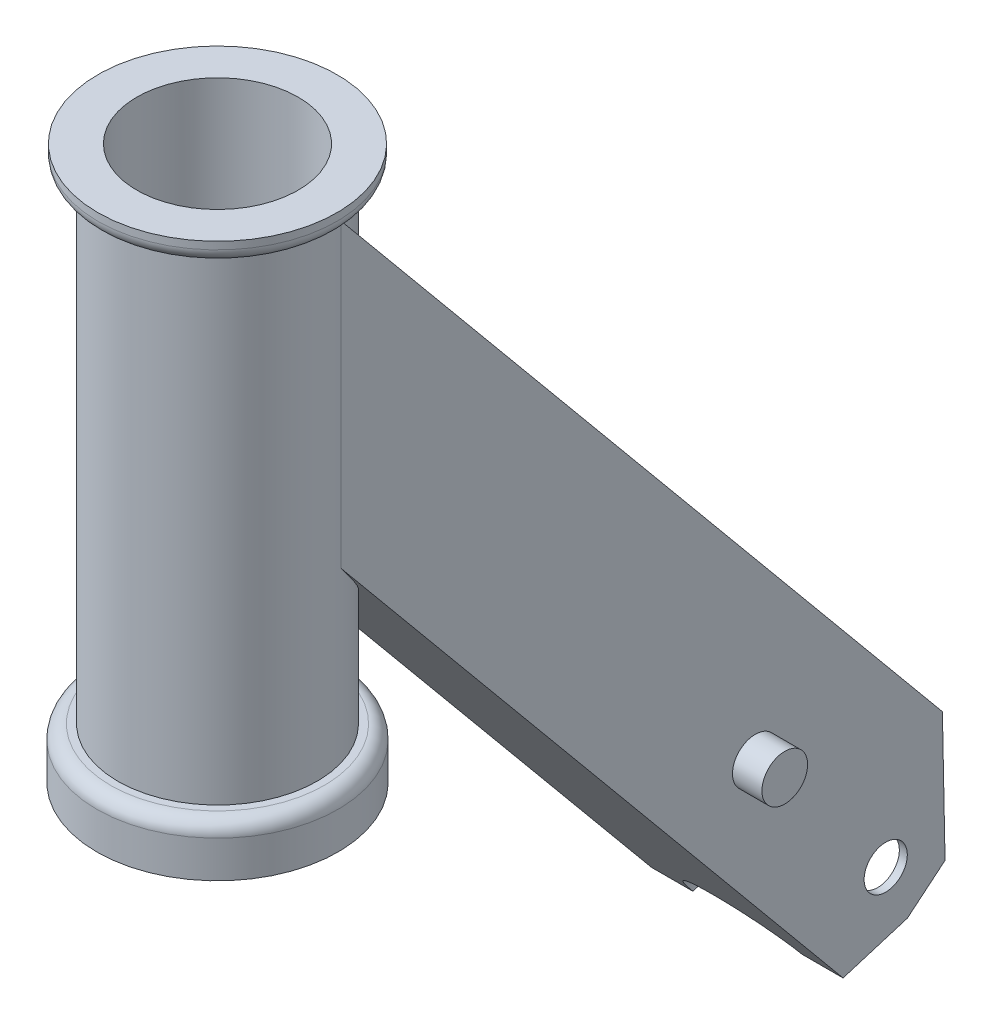
ISO-10303-21;
HEADER;
FILE_DESCRIPTION(('STEP AP214'),'2;1');
FILE_NAME('part.step','',(''),(''),'','','');
FILE_SCHEMA(('AUTOMOTIVE_DESIGN { 1 0 10303 214 1 1 1 1 }'));
ENDSEC;
DATA;
#1=APPLICATION_CONTEXT('core data for automotive mechanical design processes');
#2=APPLICATION_PROTOCOL_DEFINITION('international standard','automotive_design',2000,#1);
#3=PRODUCT_CONTEXT('',#1,'mechanical');
#4=PRODUCT('Part','Part','',(#3));
#5=PRODUCT_RELATED_PRODUCT_CATEGORY('part','',(#4));
#6=PRODUCT_DEFINITION_FORMATION('','',#4);
#7=PRODUCT_DEFINITION_CONTEXT('part definition',#1,'design');
#8=PRODUCT_DEFINITION('design','',#6,#7);
#9=PRODUCT_DEFINITION_SHAPE('','',#8);
#10=(LENGTH_UNIT() NAMED_UNIT(*) SI_UNIT(.MILLI.,.METRE.));
#11=(NAMED_UNIT(*) PLANE_ANGLE_UNIT() SI_UNIT($,.RADIAN.));
#12=(NAMED_UNIT(*) SI_UNIT($,.STERADIAN.) SOLID_ANGLE_UNIT());
#13=UNCERTAINTY_MEASURE_WITH_UNIT(LENGTH_MEASURE(1.E-05),#10,'distance_accuracy_value','');
#14=(GEOMETRIC_REPRESENTATION_CONTEXT(3) GLOBAL_UNCERTAINTY_ASSIGNED_CONTEXT((#13)) GLOBAL_UNIT_ASSIGNED_CONTEXT((#10,
#11,#12)) REPRESENTATION_CONTEXT('',''));
#15=CARTESIAN_POINT('',(0.,0.,0.));
#16=DIRECTION('',(0.,0.,1.));
#17=DIRECTION('',(1.,0.,0.));
#18=AXIS2_PLACEMENT_3D('',#15,#16,#17);
#19=CARTESIAN_POINT('',(17.5895,-103.728963419334,9.72419615617735));
#20=DIRECTION('',(-1.,0.,0.));
#21=DIRECTION('',(0.,0.,1.));
#22=AXIS2_PLACEMENT_3D('',#19,#20,#21);
#23=PLANE('',#22);
#24=DIRECTION('',(0.,0.769917595504677,0.63814331942934));
#25=VECTOR('',#24,1.);
#26=CARTESIAN_POINT('',(17.5895,97.6884,-3.31970481230389));
#27=LINE('',#26,#25);
#28=CARTESIAN_POINT('',(17.5895,-37.7445415549128,-115.572791881031));
#29=VERTEX_POINT('',#28);
#30=CARTESIAN_POINT('',(17.5895,95.5428335261872,-5.09804955939039));
#31=VERTEX_POINT('',#30);
#32=EDGE_CURVE('E232',#29,#31,#27,.T.);
#33=ORIENTED_EDGE('',*,*,#32,.T.);
#34=DIRECTION('',(0.,1.,0.));
#35=VECTOR('',#34,1.);
#36=CARTESIAN_POINT('',(17.5895,101.6,-5.09804955939038));
#37=LINE('',#36,#35);
#38=CARTESIAN_POINT('',(17.5895,40.2764083733887,-5.09804955939038));
#39=VERTEX_POINT('',#38);
#40=EDGE_CURVE('E293',#31,#39,#37,.F.);
#41=ORIENTED_EDGE('',*,*,#40,.T.);
#42=DIRECTION('',(0.,-0.769917595504677,-0.63814331942934));
#43=VECTOR('',#42,1.);
#44=CARTESIAN_POINT('',(17.5895,46.4271866374933,0.));
#45=LINE('',#44,#43);
#46=CARTESIAN_POINT('',(17.5895,-71.0023586589721,-97.3310394152556));
#47=VERTEX_POINT('',#46);
#48=EDGE_CURVE('E223',#39,#47,#45,.T.);
#49=ORIENTED_EDGE('',*,*,#48,.T.);
#50=DIRECTION('',(0.,0.292343394983634,-0.95631341066067));
#51=VECTOR('',#50,1.);
#52=CARTESIAN_POINT('',(17.5895,-67.3935548539361,-109.136154681815));
#53=LINE('',#52,#51);
#54=CARTESIAN_POINT('',(17.5895,-67.3935548539361,-109.136154681815));
#55=VERTEX_POINT('',#54);
#56=EDGE_CURVE('E225',#47,#55,#53,.T.);
#57=ORIENTED_EDGE('',*,*,#56,.T.);
#58=DIRECTION('',(0.,0.638143319429342,-0.769917595504675));
#59=VECTOR('',#58,1.);
#60=CARTESIAN_POINT('',(17.5895,-61.6556253829553,-116.058945733555));
#61=LINE('',#60,#59);
#62=CARTESIAN_POINT('',(17.5895,-61.6556253829553,-116.058945733555));
#63=VERTEX_POINT('',#62);
#64=EDGE_CURVE('E228',#55,#63,#61,.T.);
#65=ORIENTED_EDGE('',*,*,#64,.T.);
#66=DIRECTION('',(0.,0.999793374307165,0.0203275353029743));
#67=VECTOR('',#66,1.);
#68=CARTESIAN_POINT('',(17.5895,-37.7445415549128,-115.572791881031));
#69=LINE('',#68,#67);
#70=EDGE_CURVE('E230',#63,#29,#69,.T.);
#71=ORIENTED_EDGE('',*,*,#70,.T.);
#72=EDGE_LOOP('',(#33,#41,#49,#57,#65,#71));
#73=FACE_BOUND('',#72,.T.);
#74=CARTESIAN_POINT('',(17.5895,-57.2891396935477,-105.157137902319));
#75=DIRECTION('',(1.,0.,0.));
#76=DIRECTION('',(0.,0.,-1.));
#77=AXIS2_PLACEMENT_3D('',#74,#75,#76);
#78=CIRCLE('',#77,3.96875);
#79=CARTESIAN_POINT('',(17.5895,-57.2891396935477,-109.125887902319));
#80=VERTEX_POINT('',#79);
#81=EDGE_CURVE('E217',#80,#80,#78,.T.);
#82=ORIENTED_EDGE('',*,*,#81,.F.);
#83=EDGE_LOOP('',(#82));
#84=FACE_BOUND('',#83,.T.);
#85=CARTESIAN_POINT('',(17.5895,-28.3635746734894,-81.2070344289959));
#86=DIRECTION('',(-1.,0.,0.));
#87=DIRECTION('',(0.,0.,1.));
#88=AXIS2_PLACEMENT_3D('',#85,#86,#87);
#89=CIRCLE('',#88,4.19735);
#90=CARTESIAN_POINT('',(17.5895,-28.3635746734894,-77.0096844289959));
#91=VERTEX_POINT('',#90);
#92=EDGE_CURVE('E311',#91,#91,#89,.F.);
#93=ORIENTED_EDGE('',*,*,#92,.F.);
#94=EDGE_LOOP('',(#93));
#95=FACE_BOUND('',#94,.T.);
#96=ADVANCED_FACE('F35',(#73,#84,#95),#23,.F.);
#97=CARTESIAN_POINT('',(17.5895,-67.3935548539361,-109.136154681815));
#98=DIRECTION('',(0.,0.95631341066067,0.292343394983634));
#99=DIRECTION('',(0.,-0.292343394983634,0.95631341066067));
#100=AXIS2_PLACEMENT_3D('',#97,#98,#99);
#101=PLANE('',#100);
#102=DIRECTION('',(-1.,0.,0.));
#103=VECTOR('',#102,1.);
#104=CARTESIAN_POINT('',(17.5895,-71.0023586589721,-97.3310394152556));
#105=LINE('',#104,#103);
#106=CARTESIAN_POINT('',(10.0076,-71.0023586589721,-97.3310394152556));
#107=VERTEX_POINT('',#106);
#108=EDGE_CURVE('E261',#47,#107,#105,.T.);
#109=ORIENTED_EDGE('',*,*,#108,.T.);
#110=CARTESIAN_POINT('',(0.,-71.0023586589721,-97.3310394152557));
#111=DIRECTION('',(0.,0.95631341066067,0.292343394983634));
#112=DIRECTION('',(0.,-0.292343394983634,0.95631341066067));
#113=AXIS2_PLACEMENT_3D('',#110,#111,#112);
#114=ELLIPSE('',#113,25.9813025935332,10.0076);
#115=CARTESIAN_POINT('',(9.98901629563085,-70.5396915044803,-98.8445157314812));
#116=VERTEX_POINT('',#115);
#117=EDGE_CURVE('E400',#116,#107,#114,.F.);
#118=ORIENTED_EDGE('',*,*,#117,.F.);
#119=DIRECTION('',(1.,0.,0.));
#120=VECTOR('',#119,1.);
#121=CARTESIAN_POINT('',(17.5895,-70.5396915044803,-98.8445157314812));
#122=LINE('',#121,#120);
#123=CARTESIAN_POINT('',(16.129,-70.5396915044803,-98.8445157314812));
#124=VERTEX_POINT('',#123);
#125=EDGE_CURVE('E307',#116,#124,#122,.T.);
#126=ORIENTED_EDGE('',*,*,#125,.T.);
#127=DIRECTION('',(0.,0.292343394983634,-0.95631341066067));
#128=VECTOR('',#127,1.);
#129=CARTESIAN_POINT('',(16.129,-67.3935548539361,-109.136154681815));
#130=LINE('',#129,#128);
#131=CARTESIAN_POINT('',(16.129,-67.3935548539362,-109.136154681815));
#132=VERTEX_POINT('',#131);
#133=EDGE_CURVE('E206',#124,#132,#130,.T.);
#134=ORIENTED_EDGE('',*,*,#133,.T.);
#135=DIRECTION('',(-1.,0.,0.));
#136=VECTOR('',#135,1.);
#137=CARTESIAN_POINT('',(17.5895,-67.3935548539361,-109.136154681815));
#138=LINE('',#137,#136);
#139=EDGE_CURVE('E257',#55,#132,#138,.T.);
#140=ORIENTED_EDGE('',*,*,#139,.F.);
#141=ORIENTED_EDGE('',*,*,#56,.F.);
#142=EDGE_LOOP('',(#109,#118,#126,#134,#140,#141));
#143=FACE_BOUND('',#142,.T.);
#144=ADVANCED_FACE('F398',(#143),#101,.F.);
#145=CARTESIAN_POINT('',(17.5895,-37.7445415549128,-115.572791881031));
#146=DIRECTION('',(0.,-0.0203275353029743,0.999793374307165));
#147=DIRECTION('',(0.,-0.999793374307165,-0.0203275353029743));
#148=AXIS2_PLACEMENT_3D('',#145,#146,#147);
#149=PLANE('',#148);
#150=DIRECTION('',(-1.,0.,0.));
#151=VECTOR('',#150,1.);
#152=CARTESIAN_POINT('',(17.5895,-40.090765650667,-115.620494690793));
#153=LINE('',#152,#151);
#154=CARTESIAN_POINT('',(16.129,-40.090765650667,-115.620494690793));
#155=VERTEX_POINT('',#154);
#156=CARTESIAN_POINT('',(14.9225,-40.090765650667,-115.620494690793));
#157=VERTEX_POINT('',#156);
#158=EDGE_CURVE('E304',#155,#157,#153,.T.);
#159=ORIENTED_EDGE('',*,*,#158,.T.);
#160=DIRECTION('',(0.,-0.999793374307165,-0.0203275353029743));
#161=VECTOR('',#160,1.);
#162=CARTESIAN_POINT('',(14.9225,-124.841526703664,-117.343624821008));
#163=LINE('',#162,#161);
#164=CARTESIAN_POINT('',(14.9225,-37.7445415549128,-115.572791881031));
#165=VERTEX_POINT('',#164);
#166=EDGE_CURVE('E366',#165,#157,#163,.T.);
#167=ORIENTED_EDGE('',*,*,#166,.F.);
#168=DIRECTION('',(-1.,0.,0.));
#169=VECTOR('',#168,1.);
#170=CARTESIAN_POINT('',(17.5895,-37.7445415549128,-115.572791881031));
#171=LINE('',#170,#169);
#172=EDGE_CURVE('E249',#29,#165,#171,.T.);
#173=ORIENTED_EDGE('',*,*,#172,.F.);
#174=ORIENTED_EDGE('',*,*,#70,.F.);
#175=DIRECTION('',(-1.,0.,0.));
#176=VECTOR('',#175,1.);
#177=CARTESIAN_POINT('',(17.5895,-61.6556253829553,-116.058945733555));
#178=LINE('',#177,#176);
#179=CARTESIAN_POINT('',(16.129,-61.6556253829553,-116.058945733555));
#180=VERTEX_POINT('',#179);
#181=EDGE_CURVE('E253',#63,#180,#178,.T.);
#182=ORIENTED_EDGE('',*,*,#181,.T.);
#183=DIRECTION('',(0.,0.999793374307165,0.0203275353029743));
#184=VECTOR('',#183,1.);
#185=CARTESIAN_POINT('',(16.129,-37.7445415549128,-115.572791881031));
#186=LINE('',#185,#184);
#187=EDGE_CURVE('E203',#180,#155,#186,.T.);
#188=ORIENTED_EDGE('',*,*,#187,.T.);
#189=EDGE_LOOP('',(#159,#167,#173,#174,#182,#188));
#190=FACE_BOUND('',#189,.T.);
#191=ADVANCED_FACE('F365',(#190),#149,.F.);
#192=CARTESIAN_POINT('',(17.5895,-61.6556253829553,-116.058945733555));
#193=DIRECTION('',(0.,0.769917595504675,0.638143319429342));
#194=DIRECTION('',(0.,-0.638143319429342,0.769917595504675));
#195=AXIS2_PLACEMENT_3D('',#192,#193,#194);
#196=PLANE('',#195);
#197=CARTESIAN_POINT('',(-16.129,-61.6556253829553,-116.058945733555));
#198=VERTEX_POINT('',#197);
#199=CARTESIAN_POINT('',(-17.5895,-61.6556253829553,-116.058945733555));
#200=VERTEX_POINT('',#199);
#201=EDGE_CURVE('E252',#198,#200,#178,.T.);
#202=ORIENTED_EDGE('',*,*,#201,.F.);
#203=DIRECTION('',(0.,0.638143319429342,-0.769917595504675));
#204=VECTOR('',#203,1.);
#205=CARTESIAN_POINT('',(-16.129,-53.0892532772674,-126.394242543851));
#206=LINE('',#205,#204);
#207=CARTESIAN_POINT('',(-16.129,-67.3935548539362,-109.136154681815));
#208=VERTEX_POINT('',#207);
#209=EDGE_CURVE('E189',#208,#198,#206,.T.);
#210=ORIENTED_EDGE('',*,*,#209,.F.);
#211=CARTESIAN_POINT('',(-17.5895,-67.3935548539361,-109.136154681815));
#212=VERTEX_POINT('',#211);
#213=EDGE_CURVE('E256',#208,#212,#138,.T.);
#214=ORIENTED_EDGE('',*,*,#213,.T.);
#215=DIRECTION('',(0.,0.638143319429342,-0.769917595504675));
#216=VECTOR('',#215,1.);
#217=CARTESIAN_POINT('',(-17.5895,-61.6556253829553,-116.058945733555));
#218=LINE('',#217,#216);
#219=EDGE_CURVE('E241',#212,#200,#218,.T.);
#220=ORIENTED_EDGE('',*,*,#219,.T.);
#221=EDGE_LOOP('',(#202,#210,#214,#220));
#222=FACE_BOUND('',#221,.T.);
#223=ADVANCED_FACE('F346',(#222),#196,.F.);
#224=CARTESIAN_POINT('',(17.5895,-57.2891396935477,-105.157137902319));
#225=DIRECTION('',(-1.,0.,0.));
#226=DIRECTION('',(0.,0.,1.));
#227=AXIS2_PLACEMENT_3D('',#224,#225,#226);
#228=CYLINDRICAL_SURFACE('',#227,3.96875);
#229=CARTESIAN_POINT('',(-16.129,-57.2891396935477,-105.157137902319));
#230=DIRECTION('',(-1.,0.,0.));
#231=DIRECTION('',(0.,0.,1.));
#232=AXIS2_PLACEMENT_3D('',#229,#230,#231);
#233=CIRCLE('',#232,3.96875);
#234=CARTESIAN_POINT('',(-16.129,-57.2891396935477,-101.188387902319));
#235=VERTEX_POINT('',#234);
#236=EDGE_CURVE('E209',#235,#235,#233,.T.);
#237=ORIENTED_EDGE('',*,*,#236,.F.);
#238=EDGE_LOOP('',(#237));
#239=FACE_BOUND('',#238,.T.);
#240=CARTESIAN_POINT('',(-17.5895,-57.2891396935477,-105.157137902319));
#241=DIRECTION('',(1.,0.,0.));
#242=DIRECTION('',(0.,0.,-1.));
#243=AXIS2_PLACEMENT_3D('',#240,#241,#242);
#244=CIRCLE('',#243,3.96875);
#245=CARTESIAN_POINT('',(-17.5895,-57.2891396935477,-109.125887902319));
#246=VERTEX_POINT('',#245);
#247=EDGE_CURVE('E216',#246,#246,#244,.T.);
#248=ORIENTED_EDGE('',*,*,#247,.F.);
#249=EDGE_LOOP('',(#248));
#250=FACE_BOUND('',#249,.T.);
#251=ADVANCED_FACE('F470',(#239,#250),#228,.F.);
#252=CARTESIAN_POINT('',(0.,101.6,0.));
#253=DIRECTION('',(0.,1.,0.));
#254=DIRECTION('',(0.,0.,1.));
#255=AXIS2_PLACEMENT_3D('',#252,#253,#254);
#256=CYLINDRICAL_SURFACE('',#255,18.3134);
#257=CARTESIAN_POINT('',(0.,9.3218,0.));
#258=DIRECTION('',(0.,1.,0.));
#259=DIRECTION('',(0.,0.,1.));
#260=AXIS2_PLACEMENT_3D('',#257,#258,#259);
#261=CIRCLE('',#260,18.3134);
#262=CARTESIAN_POINT('',(0.,9.3218,18.3134));
#263=VERTEX_POINT('',#262);
#264=EDGE_CURVE('E276',#263,#263,#261,.T.);
#265=ORIENTED_EDGE('',*,*,#264,.T.);
#266=EDGE_LOOP('',(#265));
#267=FACE_BOUND('',#266,.T.);
#268=CARTESIAN_POINT('',(0.,97.6884,0.));
#269=DIRECTION('',(0.,1.,0.));
#270=DIRECTION('',(0.,0.,1.));
#271=AXIS2_PLACEMENT_3D('',#268,#269,#270);
#272=CIRCLE('',#271,18.3134);
#273=CARTESIAN_POINT('',(0.,97.6884,18.3134));
#274=VERTEX_POINT('',#273);
#275=EDGE_CURVE('E273',#274,#274,#272,.T.);
#276=ORIENTED_EDGE('',*,*,#275,.F.);
#277=EDGE_LOOP('',(#276));
#278=FACE_BOUND('',#277,.T.);
#279=CARTESIAN_POINT('',(0.,46.4271866374933,0.));
#280=DIRECTION('',(0.,0.63814331942934,-0.769917595504677));
#281=DIRECTION('',(0.,0.769917595504677,0.63814331942934));
#282=AXIS2_PLACEMENT_3D('',#279,#280,#281);
#283=ELLIPSE('',#282,28.6979420490945,18.3134);
#284=CARTESIAN_POINT('',(-17.5895,40.2764083733887,-5.09804955939038));
#285=VERTEX_POINT('',#284);
#286=EDGE_CURVE('E296',#39,#285,#283,.T.);
#287=ORIENTED_EDGE('',*,*,#286,.F.);
#288=ORIENTED_EDGE('',*,*,#40,.F.);
#289=CARTESIAN_POINT('',(0.,101.693611790292,0.));
#290=DIRECTION('',(0.,-0.63814331942934,0.769917595504677));
#291=DIRECTION('',(0.,0.769917595504677,0.63814331942934));
#292=AXIS2_PLACEMENT_3D('',#289,#290,#291);
#293=ELLIPSE('',#292,28.6979420490945,18.3134);
#294=CARTESIAN_POINT('',(-17.5895,95.5428335261872,-5.09804955939039));
#295=VERTEX_POINT('',#294);
#296=EDGE_CURVE('E288',#295,#31,#293,.T.);
#297=ORIENTED_EDGE('',*,*,#296,.F.);
#298=DIRECTION('',(0.,1.,0.));
#299=VECTOR('',#298,1.);
#300=CARTESIAN_POINT('',(-17.5895,101.6,-5.09804955939038));
#301=LINE('',#300,#299);
#302=EDGE_CURVE('E291',#295,#285,#301,.F.);
#303=ORIENTED_EDGE('',*,*,#302,.T.);
#304=EDGE_LOOP('',(#287,#288,#297,#303));
#305=FACE_BOUND('',#304,.T.);
#306=ADVANCED_FACE('F356',(#267,#278,#305),#256,.T.);
#307=CARTESIAN_POINT('',(0.,0.,0.));
#308=DIRECTION('',(0.,1.,0.));
#309=DIRECTION('',(0.,0.,1.));
#310=AXIS2_PLACEMENT_3D('',#307,#308,#309);
#311=PLANE('',#310);
#312=CARTESIAN_POINT('',(0.,0.,0.));
#313=DIRECTION('',(0.,-1.,0.));
#314=DIRECTION('',(0.,0.,-1.));
#315=AXIS2_PLACEMENT_3D('',#312,#313,#314);
#316=CIRCLE('',#315,14.8209);
#317=CARTESIAN_POINT('',(0.,0.,-14.8209));
#318=VERTEX_POINT('',#317);
#319=EDGE_CURVE('E494',#318,#318,#316,.T.);
#320=ORIENTED_EDGE('',*,*,#319,.F.);
#321=EDGE_LOOP('',(#320));
#322=FACE_BOUND('',#321,.T.);
#323=CARTESIAN_POINT('',(0.,0.,0.));
#324=DIRECTION('',(0.,1.,0.));
#325=DIRECTION('',(0.,0.,1.));
#326=AXIS2_PLACEMENT_3D('',#323,#324,#325);
#327=CIRCLE('',#326,22.1742);
#328=CARTESIAN_POINT('',(0.,0.,22.1742));
#329=VERTEX_POINT('',#328);
#330=EDGE_CURVE('E285',#329,#329,#327,.T.);
#331=ORIENTED_EDGE('',*,*,#330,.F.);
#332=EDGE_LOOP('',(#331));
#333=FACE_BOUND('',#332,.T.);
#334=ADVANCED_FACE('F37',(#322,#333),#311,.F.);
#335=CARTESIAN_POINT('',(0.,101.6,0.));
#336=DIRECTION('',(0.,1.,0.));
#337=DIRECTION('',(0.,0.,1.));
#338=AXIS2_PLACEMENT_3D('',#335,#336,#337);
#339=CYLINDRICAL_SURFACE('',#338,22.1742);
#340=CARTESIAN_POINT('',(0.,6.7818,0.));
#341=DIRECTION('',(0.,1.,0.));
#342=DIRECTION('',(0.,0.,1.));
#343=AXIS2_PLACEMENT_3D('',#340,#341,#342);
#344=CIRCLE('',#343,22.1742);
#345=CARTESIAN_POINT('',(0.,6.7818,22.1742));
#346=VERTEX_POINT('',#345);
#347=EDGE_CURVE('E282',#346,#346,#344,.T.);
#348=ORIENTED_EDGE('',*,*,#347,.F.);
#349=EDGE_LOOP('',(#348));
#350=FACE_BOUND('',#349,.T.);
#351=ORIENTED_EDGE('',*,*,#330,.T.);
#352=EDGE_LOOP('',(#351));
#353=FACE_BOUND('',#352,.T.);
#354=ADVANCED_FACE('F477',(#350,#353),#339,.T.);
#355=CARTESIAN_POINT('',(0.,6.7818,0.));
#356=DIRECTION('',(0.,1.,0.));
#357=DIRECTION('',(0.,0.,1.));
#358=AXIS2_PLACEMENT_3D('',#355,#356,#357);
#359=TOROIDAL_SURFACE('',#358,19.6342,2.54);
#360=CARTESIAN_POINT('',(0.,9.3218,0.));
#361=DIRECTION('',(0.,1.,0.));
#362=DIRECTION('',(0.,0.,1.));
#363=AXIS2_PLACEMENT_3D('',#360,#361,#362);
#364=CIRCLE('',#363,19.6342);
#365=CARTESIAN_POINT('',(0.,9.3218,19.6342));
#366=VERTEX_POINT('',#365);
#367=EDGE_CURVE('E279',#366,#366,#364,.T.);
#368=ORIENTED_EDGE('',*,*,#367,.F.);
#369=EDGE_LOOP('',(#368));
#370=FACE_BOUND('',#369,.T.);
#371=ORIENTED_EDGE('',*,*,#347,.T.);
#372=EDGE_LOOP('',(#371));
#373=FACE_BOUND('',#372,.T.);
#374=ADVANCED_FACE('F474',(#370,#373),#359,.T.);
#375=CARTESIAN_POINT('',(19.6342,9.3218,0.));
#376=DIRECTION('',(0.,-1.,0.));
#377=DIRECTION('',(0.,0.,-1.));
#378=AXIS2_PLACEMENT_3D('',#375,#376,#377);
#379=PLANE('',#378);
#380=ORIENTED_EDGE('',*,*,#264,.F.);
#381=EDGE_LOOP('',(#380));
#382=FACE_BOUND('',#381,.T.);
#383=ORIENTED_EDGE('',*,*,#367,.T.);
#384=EDGE_LOOP('',(#383));
#385=FACE_BOUND('',#384,.T.);
#386=ADVANCED_FACE('F466',(#382,#385),#379,.F.);
#387=CARTESIAN_POINT('',(18.3134,97.6884,0.));
#388=DIRECTION('',(0.,1.,0.));
#389=DIRECTION('',(0.,0.,1.));
#390=AXIS2_PLACEMENT_3D('',#387,#388,#389);
#391=PLANE('',#390);
#392=CARTESIAN_POINT('',(0.,97.6884,0.));
#393=DIRECTION('',(0.,1.,0.));
#394=DIRECTION('',(0.,0.,1.));
#395=AXIS2_PLACEMENT_3D('',#392,#393,#394);
#396=CIRCLE('',#395,19.431);
#397=CARTESIAN_POINT('',(0.,97.6884,19.431));
#398=VERTEX_POINT('',#397);
#399=EDGE_CURVE('E270',#398,#398,#396,.T.);
#400=ORIENTED_EDGE('',*,*,#399,.F.);
#401=EDGE_LOOP('',(#400));
#402=FACE_BOUND('',#401,.T.);
#403=ORIENTED_EDGE('',*,*,#275,.T.);
#404=EDGE_LOOP('',(#403));
#405=FACE_BOUND('',#404,.T.);
#406=ADVANCED_FACE('F462',(#402,#405),#391,.F.);
#407=CARTESIAN_POINT('',(0.,100.2284,0.));
#408=DIRECTION('',(0.,1.,0.));
#409=DIRECTION('',(0.,0.,1.));
#410=AXIS2_PLACEMENT_3D('',#407,#408,#409);
#411=TOROIDAL_SURFACE('',#410,19.431,2.54);
#412=CARTESIAN_POINT('',(0.,100.2284,0.));
#413=DIRECTION('',(0.,1.,0.));
#414=DIRECTION('',(0.,0.,1.));
#415=AXIS2_PLACEMENT_3D('',#412,#413,#414);
#416=CIRCLE('',#415,21.971);
#417=CARTESIAN_POINT('',(0.,100.2284,21.971));
#418=VERTEX_POINT('',#417);
#419=EDGE_CURVE('E267',#418,#418,#416,.T.);
#420=ORIENTED_EDGE('',*,*,#419,.F.);
#421=EDGE_LOOP('',(#420));
#422=FACE_BOUND('',#421,.T.);
#423=ORIENTED_EDGE('',*,*,#399,.T.);
#424=EDGE_LOOP('',(#423));
#425=FACE_BOUND('',#424,.T.);
#426=ADVANCED_FACE('F458',(#422,#425),#411,.T.);
#427=CARTESIAN_POINT('',(0.,101.6,0.));
#428=DIRECTION('',(0.,1.,0.));
#429=DIRECTION('',(0.,0.,1.));
#430=AXIS2_PLACEMENT_3D('',#427,#428,#429);
#431=CYLINDRICAL_SURFACE('',#430,21.971);
#432=CARTESIAN_POINT('',(0.,101.6,0.));
#433=DIRECTION('',(0.,1.,0.));
#434=DIRECTION('',(0.,0.,1.));
#435=AXIS2_PLACEMENT_3D('',#432,#433,#434);
#436=CIRCLE('',#435,21.971);
#437=CARTESIAN_POINT('',(0.,101.6,21.971));
#438=VERTEX_POINT('',#437);
#439=EDGE_CURVE('E264',#438,#438,#436,.T.);
#440=ORIENTED_EDGE('',*,*,#439,.F.);
#441=EDGE_LOOP('',(#440));
#442=FACE_BOUND('',#441,.T.);
#443=ORIENTED_EDGE('',*,*,#419,.T.);
#444=EDGE_LOOP('',(#443));
#445=FACE_BOUND('',#444,.T.);
#446=ADVANCED_FACE('F454',(#442,#445),#431,.T.);
#447=CARTESIAN_POINT('',(21.971,101.6,0.));
#448=DIRECTION('',(0.,-1.,0.));
#449=DIRECTION('',(0.,0.,-1.));
#450=AXIS2_PLACEMENT_3D('',#447,#448,#449);
#451=PLANE('',#450);
#452=CARTESIAN_POINT('',(0.,101.6,0.));
#453=DIRECTION('',(0.,-1.,0.));
#454=DIRECTION('',(0.,0.,-1.));
#455=AXIS2_PLACEMENT_3D('',#452,#453,#454);
#456=CIRCLE('',#455,14.8209);
#457=CARTESIAN_POINT('',(0.,101.6,-14.8209));
#458=VERTEX_POINT('',#457);
#459=EDGE_CURVE('E174',#458,#458,#456,.T.);
#460=ORIENTED_EDGE('',*,*,#459,.T.);
#461=EDGE_LOOP('',(#460));
#462=FACE_BOUND('',#461,.T.);
#463=ORIENTED_EDGE('',*,*,#439,.T.);
#464=EDGE_LOOP('',(#463));
#465=FACE_BOUND('',#464,.T.);
#466=ADVANCED_FACE('F322',(#462,#465),#451,.F.);
#467=CARTESIAN_POINT('',(-17.5895,-103.728963419334,9.72419615617735));
#468=DIRECTION('',(-1.,0.,0.));
#469=DIRECTION('',(0.,0.,1.));
#470=AXIS2_PLACEMENT_3D('',#467,#468,#469);
#471=PLANE('',#470);
#472=CARTESIAN_POINT('',(-17.5895,-28.3635746734894,-81.2070344289959));
#473=DIRECTION('',(-1.,0.,0.));
#474=DIRECTION('',(0.,0.,1.));
#475=AXIS2_PLACEMENT_3D('',#472,#473,#474);
#476=CIRCLE('',#475,4.19735);
#477=CARTESIAN_POINT('',(-17.5895,-28.3635746734894,-77.0096844289959));
#478=VERTEX_POINT('',#477);
#479=EDGE_CURVE('E43',#478,#478,#476,.T.);
#480=ORIENTED_EDGE('',*,*,#479,.F.);
#481=EDGE_LOOP('',(#480));
#482=FACE_BOUND('',#481,.T.);
#483=ORIENTED_EDGE('',*,*,#247,.T.);
#484=EDGE_LOOP('',(#483));
#485=FACE_BOUND('',#484,.T.);
#486=ORIENTED_EDGE('',*,*,#302,.F.);
#487=DIRECTION('',(0.,0.769917595504677,0.63814331942934));
#488=VECTOR('',#487,1.);
#489=CARTESIAN_POINT('',(-17.5895,97.6884,-3.31970481230389));
#490=LINE('',#489,#488);
#491=CARTESIAN_POINT('',(-17.5895,-37.7445415549128,-115.572791881031));
#492=VERTEX_POINT('',#491);
#493=EDGE_CURVE('E226',#492,#295,#490,.T.);
#494=ORIENTED_EDGE('',*,*,#493,.F.);
#495=DIRECTION('',(0.,0.999793374307165,0.0203275353029743));
#496=VECTOR('',#495,1.);
#497=CARTESIAN_POINT('',(-17.5895,-37.7445415549128,-115.572791881031));
#498=LINE('',#497,#496);
#499=EDGE_CURVE('E244',#200,#492,#498,.T.);
#500=ORIENTED_EDGE('',*,*,#499,.F.);
#501=ORIENTED_EDGE('',*,*,#219,.F.);
#502=DIRECTION('',(0.,0.292343394983634,-0.95631341066067));
#503=VECTOR('',#502,1.);
#504=CARTESIAN_POINT('',(-17.5895,-67.3935548539361,-109.136154681815));
#505=LINE('',#504,#503);
#506=CARTESIAN_POINT('',(-17.5895,-71.0023586589721,-97.3310394152556));
#507=VERTEX_POINT('',#506);
#508=EDGE_CURVE('E238',#507,#212,#505,.T.);
#509=ORIENTED_EDGE('',*,*,#508,.F.);
#510=DIRECTION('',(0.,-0.769917595504677,-0.63814331942934));
#511=VECTOR('',#510,1.);
#512=CARTESIAN_POINT('',(-17.5895,46.4271866374933,0.));
#513=LINE('',#512,#511);
#514=EDGE_CURVE('E220',#285,#507,#513,.T.);
#515=ORIENTED_EDGE('',*,*,#514,.F.);
#516=EDGE_LOOP('',(#486,#494,#500,#501,#509,#515));
#517=FACE_BOUND('',#516,.T.);
#518=ADVANCED_FACE('F318',(#482,#485,#517),#471,.T.);
#519=CARTESIAN_POINT('',(17.5895,46.4271866374933,0.));
#520=DIRECTION('',(0.,0.63814331942934,-0.769917595504677));
#521=DIRECTION('',(0.,0.769917595504677,0.63814331942934));
#522=AXIS2_PLACEMENT_3D('',#519,#520,#521);
#523=PLANE('',#522);
#524=CARTESIAN_POINT('',(-10.0076,-71.0023586589721,-97.3310394152556));
#525=VERTEX_POINT('',#524);
#526=EDGE_CURVE('E260',#525,#507,#105,.T.);
#527=ORIENTED_EDGE('',*,*,#526,.F.);
#528=CARTESIAN_POINT('',(0.,-71.0023586589721,-97.3310394152556));
#529=DIRECTION('',(0.,-0.63814331942934,0.769917595504677));
#530=DIRECTION('',(0.,0.769917595504677,0.63814331942934));
#531=AXIS2_PLACEMENT_3D('',#528,#529,#530);
#532=CIRCLE('',#531,10.0076);
#533=EDGE_CURVE('E409',#107,#525,#532,.T.);
#534=ORIENTED_EDGE('',*,*,#533,.F.);
#535=ORIENTED_EDGE('',*,*,#108,.F.);
#536=ORIENTED_EDGE('',*,*,#48,.F.);
#537=ORIENTED_EDGE('',*,*,#286,.T.);
#538=ORIENTED_EDGE('',*,*,#514,.T.);
#539=EDGE_LOOP('',(#527,#534,#535,#536,#537,#538));
#540=FACE_BOUND('',#539,.T.);
#541=ADVANCED_FACE('F321',(#540),#523,.F.);
#542=CARTESIAN_POINT('',(17.5895,97.6884,-3.31970481230389));
#543=DIRECTION('',(0.,-0.63814331942934,0.769917595504677));
#544=DIRECTION('',(0.,-0.769917595504677,-0.63814331942934));
#545=AXIS2_PLACEMENT_3D('',#542,#543,#544);
#546=PLANE('',#545);
#547=ORIENTED_EDGE('',*,*,#172,.T.);
#548=DIRECTION('',(0.,-0.769917595504676,-0.638143319429341));
#549=VECTOR('',#548,1.);
#550=CARTESIAN_POINT('',(14.9225,-45.5170161209302,-122.01497835488));
#551=LINE('',#550,#549);
#552=CARTESIAN_POINT('',(14.9225,-33.8431381232119,-112.339128238487));
#553=VERTEX_POINT('',#552);
#554=EDGE_CURVE('E362',#553,#165,#551,.T.);
#555=ORIENTED_EDGE('',*,*,#554,.F.);
#556=CARTESIAN_POINT('',(0.,-33.8431381232119,-112.339128238487));
#557=DIRECTION('',(0.,0.63814331942934,-0.769917595504677));
#558=DIRECTION('',(0.,-0.769917595504677,-0.63814331942934));
#559=AXIS2_PLACEMENT_3D('',#556,#557,#558);
#560=CIRCLE('',#559,14.9225);
#561=CARTESIAN_POINT('',(-14.9225,-33.8431381232119,-112.339128238487));
#562=VERTEX_POINT('',#561);
#563=EDGE_CURVE('E380',#562,#553,#560,.T.);
#564=ORIENTED_EDGE('',*,*,#563,.F.);
#565=DIRECTION('',(0.,0.769917595504676,0.638143319429341));
#566=VECTOR('',#565,1.);
#567=CARTESIAN_POINT('',(-14.9225,-33.8431381232119,-112.339128238487));
#568=LINE('',#567,#566);
#569=CARTESIAN_POINT('',(-14.9225,-37.7445415549128,-115.572791881031));
#570=VERTEX_POINT('',#569);
#571=EDGE_CURVE('E339',#570,#562,#568,.T.);
#572=ORIENTED_EDGE('',*,*,#571,.F.);
#573=EDGE_CURVE('E235',#570,#492,#171,.T.);
#574=ORIENTED_EDGE('',*,*,#573,.T.);
#575=ORIENTED_EDGE('',*,*,#493,.T.);
#576=ORIENTED_EDGE('',*,*,#296,.T.);
#577=ORIENTED_EDGE('',*,*,#32,.F.);
#578=EDGE_LOOP('',(#547,#555,#564,#572,#574,#575,#576,#577));
#579=FACE_BOUND('',#578,.T.);
#580=ADVANCED_FACE('F333',(#579),#546,.F.);
#581=CARTESIAN_POINT('',(-16.129,-70.5396915044803,-98.8445157314812));
#582=VERTEX_POINT('',#581);
#583=CARTESIAN_POINT('',(-9.98901629563086,-70.5396915044803,-98.8445157314812));
#584=VERTEX_POINT('',#583);
#585=EDGE_CURVE('E308',#582,#584,#122,.T.);
#586=ORIENTED_EDGE('',*,*,#585,.T.);
#587=EDGE_CURVE('E56',#525,#584,#114,.F.);
#588=ORIENTED_EDGE('',*,*,#587,.F.);
#589=ORIENTED_EDGE('',*,*,#526,.T.);
#590=ORIENTED_EDGE('',*,*,#508,.T.);
#591=ORIENTED_EDGE('',*,*,#213,.F.);
#592=DIRECTION('',(0.,-0.292343394983634,0.95631341066067));
#593=VECTOR('',#592,1.);
#594=CARTESIAN_POINT('',(-16.129,-67.3935548539361,-109.136154681815));
#595=LINE('',#594,#593);
#596=EDGE_CURVE('E213',#208,#582,#595,.T.);
#597=ORIENTED_EDGE('',*,*,#596,.T.);
#598=EDGE_LOOP('',(#586,#588,#589,#590,#591,#597));
#599=FACE_BOUND('',#598,.T.);
#600=ADVANCED_FACE('F350',(#599),#101,.F.);
#601=ORIENTED_EDGE('',*,*,#139,.T.);
#602=DIRECTION('',(0.,-0.638143319429342,0.769917595504675));
#603=VECTOR('',#602,1.);
#604=CARTESIAN_POINT('',(16.129,-53.0892532772674,-126.394242543851));
#605=LINE('',#604,#603);
#606=EDGE_CURVE('E191',#180,#132,#605,.T.);
#607=ORIENTED_EDGE('',*,*,#606,.F.);
#608=ORIENTED_EDGE('',*,*,#181,.F.);
#609=ORIENTED_EDGE('',*,*,#64,.F.);
#610=EDGE_LOOP('',(#601,#607,#608,#609));
#611=FACE_BOUND('',#610,.T.);
#612=ADVANCED_FACE('F445',(#611),#196,.F.);
#613=ORIENTED_EDGE('',*,*,#573,.F.);
#614=DIRECTION('',(0.,0.999793374307165,0.0203275353029743));
#615=VECTOR('',#614,1.);
#616=CARTESIAN_POINT('',(-14.9225,-112.97582690939,-117.10237454104));
#617=LINE('',#616,#615);
#618=CARTESIAN_POINT('',(-14.9225,-40.090765650667,-115.620494690793));
#619=VERTEX_POINT('',#618);
#620=EDGE_CURVE('E371',#619,#570,#617,.T.);
#621=ORIENTED_EDGE('',*,*,#620,.F.);
#622=CARTESIAN_POINT('',(-16.129,-40.090765650667,-115.620494690793));
#623=VERTEX_POINT('',#622);
#624=EDGE_CURVE('E299',#619,#623,#153,.T.);
#625=ORIENTED_EDGE('',*,*,#624,.T.);
#626=DIRECTION('',(0.,-0.999793374307165,-0.0203275353029743));
#627=VECTOR('',#626,1.);
#628=CARTESIAN_POINT('',(-16.129,-37.7445415549128,-115.572791881031));
#629=LINE('',#628,#627);
#630=EDGE_CURVE('E210',#623,#198,#629,.T.);
#631=ORIENTED_EDGE('',*,*,#630,.T.);
#632=ORIENTED_EDGE('',*,*,#201,.T.);
#633=ORIENTED_EDGE('',*,*,#499,.T.);
#634=EDGE_LOOP('',(#613,#621,#625,#631,#632,#633));
#635=FACE_BOUND('',#634,.T.);
#636=ADVANCED_FACE('F342',(#635),#149,.F.);
#637=CARTESIAN_POINT('',(16.129,-57.2891396935477,-105.157137902319));
#638=DIRECTION('',(1.,0.,0.));
#639=DIRECTION('',(0.,0.,-1.));
#640=AXIS2_PLACEMENT_3D('',#637,#638,#639);
#641=CIRCLE('',#640,3.96875);
#642=CARTESIAN_POINT('',(16.129,-57.2891396935477,-109.125887902319));
#643=VERTEX_POINT('',#642);
#644=EDGE_CURVE('E198',#643,#643,#641,.T.);
#645=ORIENTED_EDGE('',*,*,#644,.F.);
#646=EDGE_LOOP('',(#645));
#647=FACE_BOUND('',#646,.T.);
#648=ORIENTED_EDGE('',*,*,#81,.T.);
#649=EDGE_LOOP('',(#648));
#650=FACE_BOUND('',#649,.T.);
#651=ADVANCED_FACE('F439',(#647,#650),#228,.F.);
#652=CARTESIAN_POINT('',(-16.129,41.3553008419265,-6.10076982884153));
#653=DIRECTION('',(0.,-0.638143319429342,0.769917595504675));
#654=DIRECTION('',(0.,-0.769917595504675,-0.638143319429342));
#655=AXIS2_PLACEMENT_3D('',#652,#653,#654);
#656=PLANE('',#655);
#657=DIRECTION('',(-1.,0.,0.));
#658=VECTOR('',#657,1.);
#659=CARTESIAN_POINT('',(-16.129,41.3553008419265,-6.10076982884153));
#660=LINE('',#659,#658);
#661=CARTESIAN_POINT('',(-13.5070235176184,41.3553008419265,-6.10076982884153));
#662=VERTEX_POINT('',#661);
#663=CARTESIAN_POINT('',(-16.129,41.3553008419265,-6.10076982884153));
#664=VERTEX_POINT('',#663);
#665=EDGE_CURVE('E172',#662,#664,#660,.T.);
#666=ORIENTED_EDGE('',*,*,#665,.F.);
#667=CARTESIAN_POINT('',(0.,48.7158574666507,0.));
#668=DIRECTION('',(0.,-0.638143319429342,0.769917595504675));
#669=DIRECTION('',(0.,-0.769917595504675,-0.638143319429342));
#670=AXIS2_PLACEMENT_3D('',#667,#668,#669);
#671=ELLIPSE('',#670,23.2250335445861,14.8209);
#672=CARTESIAN_POINT('',(13.5070235176184,41.3553008419265,-6.10076982884153));
#673=VERTEX_POINT('',#672);
#674=EDGE_CURVE('E49',#662,#673,#671,.T.);
#675=ORIENTED_EDGE('',*,*,#674,.T.);
#676=CARTESIAN_POINT('',(16.129,41.3553008419265,-6.10076982884153));
#677=VERTEX_POINT('',#676);
#678=EDGE_CURVE('E170',#677,#673,#660,.T.);
#679=ORIENTED_EDGE('',*,*,#678,.F.);
#680=DIRECTION('',(0.,-0.769917595504675,-0.638143319429342));
#681=VECTOR('',#680,1.);
#682=CARTESIAN_POINT('',(16.129,41.3553008419265,-6.10076982884153));
#683=LINE('',#682,#681);
#684=EDGE_CURVE('E199',#677,#124,#683,.T.);
#685=ORIENTED_EDGE('',*,*,#684,.T.);
#686=ORIENTED_EDGE('',*,*,#125,.F.);
#687=CARTESIAN_POINT('',(0.,-70.0703503409456,-98.4555040634902));
#688=DIRECTION('',(0.,-0.638143319429342,0.769917595504675));
#689=DIRECTION('',(0.,-0.769917595504675,-0.638143319429342));
#690=AXIS2_PLACEMENT_3D('',#687,#688,#689);
#691=CIRCLE('',#690,10.0076);
#692=EDGE_CURVE('E395',#584,#116,#691,.F.);
#693=ORIENTED_EDGE('',*,*,#692,.F.);
#694=ORIENTED_EDGE('',*,*,#585,.F.);
#695=DIRECTION('',(0.,-0.769917595504675,-0.638143319429342));
#696=VECTOR('',#695,1.);
#697=CARTESIAN_POINT('',(-16.129,41.3553008419265,-6.10076982884153));
#698=LINE('',#697,#696);
#699=EDGE_CURVE('E195',#664,#582,#698,.T.);
#700=ORIENTED_EDGE('',*,*,#699,.F.);
#701=EDGE_LOOP('',(#666,#675,#679,#685,#686,#693,#694,#700));
#702=FACE_BOUND('',#701,.T.);
#703=ADVANCED_FACE('F168',(#702),#656,.F.);
#704=CARTESIAN_POINT('',(-16.129,61.9972589811758,-31.0052172988721));
#705=DIRECTION('',(0.,0.638143319429342,-0.769917595504675));
#706=DIRECTION('',(0.,0.769917595504675,0.638143319429342));
#707=AXIS2_PLACEMENT_3D('',#704,#705,#706);
#708=PLANE('',#707);
#709=CARTESIAN_POINT('',(0.,-34.7751464412382,-111.214663590253));
#710=DIRECTION('',(0.,0.638143319429342,-0.769917595504675));
#711=DIRECTION('',(0.,0.769917595504675,0.638143319429342));
#712=AXIS2_PLACEMENT_3D('',#709,#710,#711);
#713=CIRCLE('',#712,14.9225);
#714=CARTESIAN_POINT('',(14.9225,-34.7751464412382,-111.214663590253));
#715=VERTEX_POINT('',#714);
#716=CARTESIAN_POINT('',(-14.9225,-34.7751464412382,-111.214663590253));
#717=VERTEX_POINT('',#716);
#718=EDGE_CURVE('E370',#715,#717,#713,.F.);
#719=ORIENTED_EDGE('',*,*,#718,.F.);
#720=DIRECTION('',(0.,0.769917595504675,0.638143319429342));
#721=VECTOR('',#720,1.);
#722=CARTESIAN_POINT('',(14.9225,-46.4490244389562,-120.890513706646));
#723=LINE('',#722,#721);
#724=EDGE_CURVE('E192',#157,#715,#723,.T.);
#725=ORIENTED_EDGE('',*,*,#724,.F.);
#726=ORIENTED_EDGE('',*,*,#158,.F.);
#727=DIRECTION('',(0.,-0.769917595504675,-0.638143319429342));
#728=VECTOR('',#727,1.);
#729=CARTESIAN_POINT('',(16.129,61.9972589811758,-31.0052172988721));
#730=LINE('',#729,#728);
#731=CARTESIAN_POINT('',(16.129,61.9972589811758,-31.0052172988721));
#732=VERTEX_POINT('',#731);
#733=EDGE_CURVE('E184',#732,#155,#730,.T.);
#734=ORIENTED_EDGE('',*,*,#733,.F.);
#735=DIRECTION('',(1.,0.,0.));
#736=VECTOR('',#735,1.);
#737=CARTESIAN_POINT('',(-16.129,61.9972589811758,-31.0052172988721));
#738=LINE('',#737,#736);
#739=CARTESIAN_POINT('',(-16.129,61.9972589811758,-31.0052172988721));
#740=VERTEX_POINT('',#739);
#741=EDGE_CURVE('E383',#740,#732,#738,.T.);
#742=ORIENTED_EDGE('',*,*,#741,.F.);
#743=DIRECTION('',(0.,-0.769917595504675,-0.638143319429342));
#744=VECTOR('',#743,1.);
#745=CARTESIAN_POINT('',(-16.129,61.9972589811758,-31.0052172988721));
#746=LINE('',#745,#744);
#747=EDGE_CURVE('E181',#740,#623,#746,.T.);
#748=ORIENTED_EDGE('',*,*,#747,.T.);
#749=ORIENTED_EDGE('',*,*,#624,.F.);
#750=DIRECTION('',(0.,-0.769917595504675,-0.638143319429342));
#751=VECTOR('',#750,1.);
#752=CARTESIAN_POINT('',(-14.9225,-34.7751464412379,-111.214663590253));
#753=LINE('',#752,#751);
#754=EDGE_CURVE('E373',#717,#619,#753,.T.);
#755=ORIENTED_EDGE('',*,*,#754,.F.);
#756=EDGE_LOOP('',(#719,#725,#726,#734,#742,#748,#749,#755));
#757=FACE_BOUND('',#756,.T.);
#758=ADVANCED_FACE('F388',(#757),#708,.F.);
#759=CARTESIAN_POINT('',(-16.129,61.9972589811758,-31.0052172988721));
#760=DIRECTION('',(-1.,0.,0.));
#761=DIRECTION('',(0.,0.,1.));
#762=AXIS2_PLACEMENT_3D('',#759,#760,#761);
#763=PLANE('',#762);
#764=ORIENTED_EDGE('',*,*,#236,.T.);
#765=EDGE_LOOP('',(#764));
#766=FACE_BOUND('',#765,.T.);
#767=ORIENTED_EDGE('',*,*,#209,.T.);
#768=ORIENTED_EDGE('',*,*,#630,.F.);
#769=ORIENTED_EDGE('',*,*,#747,.F.);
#770=DIRECTION('',(0.,0.638143319429342,-0.769917595504675));
#771=VECTOR('',#770,1.);
#772=CARTESIAN_POINT('',(-16.129,61.9972589811758,-31.0052172988721));
#773=LINE('',#772,#771);
#774=EDGE_CURVE('E194',#664,#740,#773,.T.);
#775=ORIENTED_EDGE('',*,*,#774,.F.);
#776=ORIENTED_EDGE('',*,*,#699,.T.);
#777=ORIENTED_EDGE('',*,*,#596,.F.);
#778=EDGE_LOOP('',(#767,#768,#769,#775,#776,#777));
#779=FACE_BOUND('',#778,.T.);
#780=ADVANCED_FACE('F421',(#766,#779),#763,.F.);
#781=CARTESIAN_POINT('',(16.129,61.9972589811758,-31.0052172988721));
#782=DIRECTION('',(1.,0.,0.));
#783=DIRECTION('',(0.,0.,-1.));
#784=AXIS2_PLACEMENT_3D('',#781,#782,#783);
#785=PLANE('',#784);
#786=ORIENTED_EDGE('',*,*,#644,.T.);
#787=EDGE_LOOP('',(#786));
#788=FACE_BOUND('',#787,.T.);
#789=ORIENTED_EDGE('',*,*,#684,.F.);
#790=DIRECTION('',(0.,-0.638143319429342,0.769917595504675));
#791=VECTOR('',#790,1.);
#792=CARTESIAN_POINT('',(16.129,61.9972589811758,-31.0052172988721));
#793=LINE('',#792,#791);
#794=EDGE_CURVE('E180',#732,#677,#793,.T.);
#795=ORIENTED_EDGE('',*,*,#794,.F.);
#796=ORIENTED_EDGE('',*,*,#733,.T.);
#797=ORIENTED_EDGE('',*,*,#187,.F.);
#798=ORIENTED_EDGE('',*,*,#606,.T.);
#799=ORIENTED_EDGE('',*,*,#133,.F.);
#800=EDGE_LOOP('',(#789,#795,#796,#797,#798,#799));
#801=FACE_BOUND('',#800,.T.);
#802=ADVANCED_FACE('F392',(#788,#801),#785,.F.);
#803=CARTESIAN_POINT('',(-16.129,41.3553008419265,-6.10076982884153));
#804=DIRECTION('',(0.,0.769917595504675,0.638143319429342));
#805=DIRECTION('',(0.,-0.638143319429342,0.769917595504675));
#806=AXIS2_PLACEMENT_3D('',#803,#804,#805);
#807=PLANE('',#806);
#808=ORIENTED_EDGE('',*,*,#678,.T.);
#809=CARTESIAN_POINT('',(0.,36.298700587065,0.));
#810=DIRECTION('',(0.,0.769917595504675,0.638143319429342));
#811=DIRECTION('',(0.,-0.638143319429342,0.769917595504675));
#812=AXIS2_PLACEMENT_3D('',#809,#810,#811);
#813=ELLIPSE('',#812,19.249982188399,14.8209);
#814=EDGE_CURVE('E11',#673,#662,#813,.T.);
#815=ORIENTED_EDGE('',*,*,#814,.T.);
#816=ORIENTED_EDGE('',*,*,#665,.T.);
#817=ORIENTED_EDGE('',*,*,#774,.T.);
#818=ORIENTED_EDGE('',*,*,#741,.T.);
#819=ORIENTED_EDGE('',*,*,#794,.T.);
#820=EDGE_LOOP('',(#808,#815,#816,#817,#818,#819));
#821=FACE_BOUND('',#820,.T.);
#822=ADVANCED_FACE('F177',(#821),#807,.F.);
#823=CARTESIAN_POINT('',(14.9225,-126.738937183566,-24.021025800873));
#824=DIRECTION('',(1.,0.,0.));
#825=DIRECTION('',(0.,0.,-1.));
#826=AXIS2_PLACEMENT_3D('',#823,#824,#825);
#827=PLANE('',#826);
#828=ORIENTED_EDGE('',*,*,#166,.T.);
#829=ORIENTED_EDGE('',*,*,#724,.T.);
#830=DIRECTION('',(0.,0.63814331942934,-0.769917595504677));
#831=VECTOR('',#830,1.);
#832=CARTESIAN_POINT('',(14.9225,-115.065059185848,-14.3451756844798));
#833=LINE('',#832,#831);
#834=EDGE_CURVE('E375',#715,#553,#833,.T.);
#835=ORIENTED_EDGE('',*,*,#834,.T.);
#836=ORIENTED_EDGE('',*,*,#554,.T.);
#837=EDGE_LOOP('',(#828,#829,#835,#836));
#838=FACE_BOUND('',#837,.T.);
#839=ADVANCED_FACE('F530',(#838),#827,.F.);
#840=CARTESIAN_POINT('',(-14.9225,-115.065059185848,-14.3451756844798));
#841=DIRECTION('',(-1.,0.,0.));
#842=DIRECTION('',(0.,-1.,0.));
#843=AXIS2_PLACEMENT_3D('',#840,#841,#842);
#844=PLANE('',#843);
#845=ORIENTED_EDGE('',*,*,#620,.T.);
#846=ORIENTED_EDGE('',*,*,#571,.T.);
#847=DIRECTION('',(0.,0.63814331942934,-0.769917595504677));
#848=VECTOR('',#847,1.);
#849=CARTESIAN_POINT('',(-14.9225,-115.065059185848,-14.3451756844798));
#850=LINE('',#849,#848);
#851=EDGE_CURVE('E378',#717,#562,#850,.T.);
#852=ORIENTED_EDGE('',*,*,#851,.F.);
#853=ORIENTED_EDGE('',*,*,#754,.T.);
#854=EDGE_LOOP('',(#845,#846,#852,#853));
#855=FACE_BOUND('',#854,.T.);
#856=ADVANCED_FACE('F419',(#855),#844,.F.);
#857=CARTESIAN_POINT('',(0.,-115.065059185848,-14.3451756844798));
#858=DIRECTION('',(0.,0.63814331942934,-0.769917595504677));
#859=DIRECTION('',(0.,0.769917595504677,0.63814331942934));
#860=AXIS2_PLACEMENT_3D('',#857,#858,#859);
#861=CYLINDRICAL_SURFACE('',#860,14.9225);
#862=ORIENTED_EDGE('',*,*,#718,.T.);
#863=ORIENTED_EDGE('',*,*,#851,.T.);
#864=ORIENTED_EDGE('',*,*,#563,.T.);
#865=ORIENTED_EDGE('',*,*,#834,.F.);
#866=EDGE_LOOP('',(#862,#863,#864,#865));
#867=FACE_BOUND('',#866,.T.);
#868=ADVANCED_FACE('F524',(#867),#861,.F.);
#869=CARTESIAN_POINT('',(0.,8.48821583811994,-193.236128630662));
#870=DIRECTION('',(0.,-0.63814331942934,0.769917595504677));
#871=DIRECTION('',(0.,-0.769917595504677,-0.63814331942934));
#872=AXIS2_PLACEMENT_3D('',#869,#870,#871);
#873=CYLINDRICAL_SURFACE('',#872,10.0076);
#874=ORIENTED_EDGE('',*,*,#587,.T.);
#875=ORIENTED_EDGE('',*,*,#692,.T.);
#876=ORIENTED_EDGE('',*,*,#117,.T.);
#877=ORIENTED_EDGE('',*,*,#533,.T.);
#878=EDGE_LOOP('',(#874,#875,#876,#877));
#879=FACE_BOUND('',#878,.T.);
#880=ADVANCED_FACE('F520',(#879),#873,.F.);
#881=CARTESIAN_POINT('',(22.9997,-28.3635746734894,-81.2070344289959));
#882=DIRECTION('',(-1.,0.,0.));
#883=DIRECTION('',(0.,0.,1.));
#884=AXIS2_PLACEMENT_3D('',#881,#882,#883);
#885=CYLINDRICAL_SURFACE('',#884,4.19735);
#886=CARTESIAN_POINT('',(22.9997,-28.3635746734894,-81.2070344289959));
#887=DIRECTION('',(1.,0.,0.));
#888=DIRECTION('',(0.,0.,-1.));
#889=AXIS2_PLACEMENT_3D('',#886,#887,#888);
#890=CIRCLE('',#889,4.19735);
#891=CARTESIAN_POINT('',(22.9997,-28.3635746734894,-85.4043844289959));
#892=VERTEX_POINT('',#891);
#893=EDGE_CURVE('E402',#892,#892,#890,.T.);
#894=ORIENTED_EDGE('',*,*,#893,.F.);
#895=EDGE_LOOP('',(#894));
#896=FACE_BOUND('',#895,.T.);
#897=ORIENTED_EDGE('',*,*,#92,.T.);
#898=EDGE_LOOP('',(#897));
#899=FACE_BOUND('',#898,.T.);
#900=ADVANCED_FACE('F516',(#896,#899),#885,.T.);
#901=CARTESIAN_POINT('',(22.9997,-28.3635746734894,-81.2070344289959));
#902=DIRECTION('',(1.,0.,0.));
#903=DIRECTION('',(0.,0.,-1.));
#904=AXIS2_PLACEMENT_3D('',#901,#902,#903);
#905=PLANE('',#904);
#906=ORIENTED_EDGE('',*,*,#893,.T.);
#907=EDGE_LOOP('',(#906));
#908=FACE_BOUND('',#907,.T.);
#909=ADVANCED_FACE('F511',(#908),#905,.T.);
#910=CARTESIAN_POINT('',(-22.9997,-28.3635746734894,-81.2070344289959));
#911=DIRECTION('',(1.,0.,0.));
#912=DIRECTION('',(0.,0.,-1.));
#913=AXIS2_PLACEMENT_3D('',#910,#911,#912);
#914=CYLINDRICAL_SURFACE('',#913,4.19735);
#915=CARTESIAN_POINT('',(-22.9997,-28.3635746734894,-81.2070344289959));
#916=DIRECTION('',(1.,0.,0.));
#917=DIRECTION('',(0.,0.,-1.));
#918=AXIS2_PLACEMENT_3D('',#915,#916,#917);
#919=CIRCLE('',#918,4.19735);
#920=CARTESIAN_POINT('',(-22.9997,-28.3635746734894,-85.4043844289959));
#921=VERTEX_POINT('',#920);
#922=EDGE_CURVE('E173',#921,#921,#919,.T.);
#923=ORIENTED_EDGE('',*,*,#922,.T.);
#924=EDGE_LOOP('',(#923));
#925=FACE_BOUND('',#924,.T.);
#926=ORIENTED_EDGE('',*,*,#479,.T.);
#927=EDGE_LOOP('',(#926));
#928=FACE_BOUND('',#927,.T.);
#929=ADVANCED_FACE('F316',(#925,#928),#914,.T.);
#930=CARTESIAN_POINT('',(-22.9997,-28.3635746734894,-81.2070344289959));
#931=DIRECTION('',(-1.,0.,0.));
#932=DIRECTION('',(0.,0.,-1.));
#933=AXIS2_PLACEMENT_3D('',#930,#931,#932);
#934=PLANE('',#933);
#935=ORIENTED_EDGE('',*,*,#922,.F.);
#936=EDGE_LOOP('',(#935));
#937=FACE_BOUND('',#936,.T.);
#938=ADVANCED_FACE('F503',(#937),#934,.T.);
#939=CARTESIAN_POINT('',(0.,101.6,0.));
#940=DIRECTION('',(0.,-1.,0.));
#941=DIRECTION('',(0.,0.,-1.));
#942=AXIS2_PLACEMENT_3D('',#939,#940,#941);
#943=CYLINDRICAL_SURFACE('',#942,14.8209);
#944=ORIENTED_EDGE('',*,*,#319,.T.);
#945=EDGE_LOOP('',(#944));
#946=FACE_BOUND('',#945,.T.);
#947=ORIENTED_EDGE('',*,*,#459,.F.);
#948=EDGE_LOOP('',(#947));
#949=FACE_BOUND('',#948,.T.);
#950=ORIENTED_EDGE('',*,*,#814,.F.);
#951=ORIENTED_EDGE('',*,*,#674,.F.);
#952=EDGE_LOOP('',(#950,#951));
#953=FACE_BOUND('',#952,.T.);
#954=ADVANCED_FACE('F162',(#946,#949,#953),#943,.F.);
#955=CLOSED_SHELL('',(#96,#144,#191,#223,#251,#306,#334,#354,#374,#386,#406,#426,#446,#466,#518,
#541,#580,#600,#612,#636,#651,#703,#758,#780,#802,#822,#839,#856,#868,#880,#900,#909,#929,#938,#954));
#956=MANIFOLD_SOLID_BREP('B2',#955);
#957=ADVANCED_BREP_SHAPE_REPRESENTATION('',(#18,#956),#14);
#958=SHAPE_DEFINITION_REPRESENTATION(#9,#957);
ENDSEC;
END-ISO-10303-21;
